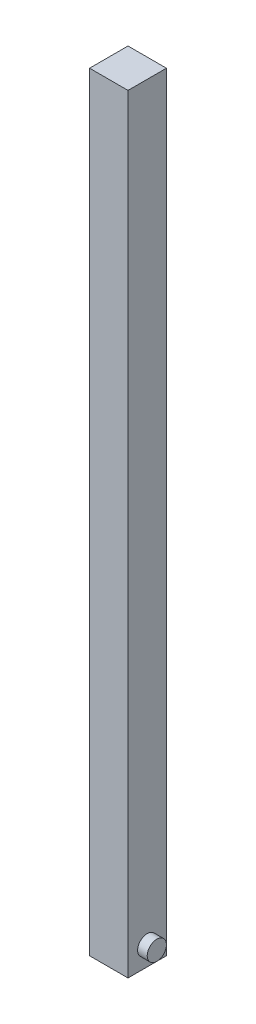
ISO-10303-21;
HEADER;
FILE_DESCRIPTION(('STEP AP214'),'2;1');
FILE_NAME('part.step','',(''),(''),'','','');
FILE_SCHEMA(('AUTOMOTIVE_DESIGN { 1 0 10303 214 1 1 1 1 }'));
ENDSEC;
DATA;
#1=APPLICATION_CONTEXT('core data for automotive mechanical design processes');
#2=APPLICATION_PROTOCOL_DEFINITION('international standard','automotive_design',2000,#1);
#3=PRODUCT_CONTEXT('',#1,'mechanical');
#4=PRODUCT('Part','Part','',(#3));
#5=PRODUCT_RELATED_PRODUCT_CATEGORY('part','',(#4));
#6=PRODUCT_DEFINITION_FORMATION('','',#4);
#7=PRODUCT_DEFINITION_CONTEXT('part definition',#1,'design');
#8=PRODUCT_DEFINITION('design','',#6,#7);
#9=PRODUCT_DEFINITION_SHAPE('','',#8);
#10=(LENGTH_UNIT() NAMED_UNIT(*) SI_UNIT(.MILLI.,.METRE.));
#11=(NAMED_UNIT(*) PLANE_ANGLE_UNIT() SI_UNIT($,.RADIAN.));
#12=(NAMED_UNIT(*) SI_UNIT($,.STERADIAN.) SOLID_ANGLE_UNIT());
#13=UNCERTAINTY_MEASURE_WITH_UNIT(LENGTH_MEASURE(1.E-05),#10,'distance_accuracy_value','');
#14=(GEOMETRIC_REPRESENTATION_CONTEXT(3) GLOBAL_UNCERTAINTY_ASSIGNED_CONTEXT((#13)) GLOBAL_UNIT_ASSIGNED_CONTEXT((#10,
#11,#12)) REPRESENTATION_CONTEXT('',''));
#15=CARTESIAN_POINT('',(0.,0.,0.));
#16=DIRECTION('',(0.,0.,1.));
#17=DIRECTION('',(1.,0.,0.));
#18=AXIS2_PLACEMENT_3D('',#15,#16,#17);
#19=CARTESIAN_POINT('',(0.,508.,0.));
#20=DIRECTION('',(1.,0.,0.));
#21=DIRECTION('',(0.,0.,-1.));
#22=AXIS2_PLACEMENT_3D('',#19,#20,#21);
#23=PLANE('',#22);
#24=DIRECTION('',(0.,0.,1.));
#25=VECTOR('',#24,1.);
#26=CARTESIAN_POINT('',(0.,0.,0.));
#27=LINE('',#26,#25);
#28=CARTESIAN_POINT('',(0.,0.,-25.4));
#29=VERTEX_POINT('',#28);
#30=CARTESIAN_POINT('',(0.,0.,0.));
#31=VERTEX_POINT('',#30);
#32=EDGE_CURVE('E110',#29,#31,#27,.T.);
#33=ORIENTED_EDGE('',*,*,#32,.T.);
#34=DIRECTION('',(0.,-1.,0.));
#35=VECTOR('',#34,1.);
#36=CARTESIAN_POINT('',(0.,508.,0.));
#37=LINE('',#36,#35);
#38=CARTESIAN_POINT('',(0.,508.,0.));
#39=VERTEX_POINT('',#38);
#40=EDGE_CURVE('E48',#39,#31,#37,.T.);
#41=ORIENTED_EDGE('',*,*,#40,.F.);
#42=DIRECTION('',(0.,0.,1.));
#43=VECTOR('',#42,1.);
#44=CARTESIAN_POINT('',(0.,508.,0.));
#45=LINE('',#44,#43);
#46=CARTESIAN_POINT('',(0.,508.,-25.4));
#47=VERTEX_POINT('',#46);
#48=EDGE_CURVE('E92',#47,#39,#45,.T.);
#49=ORIENTED_EDGE('',*,*,#48,.F.);
#50=DIRECTION('',(0.,-1.,0.));
#51=VECTOR('',#50,1.);
#52=CARTESIAN_POINT('',(0.,508.,-25.4));
#53=LINE('',#52,#51);
#54=EDGE_CURVE('E106',#47,#29,#53,.T.);
#55=ORIENTED_EDGE('',*,*,#54,.T.);
#56=EDGE_LOOP('',(#33,#41,#49,#55));
#57=FACE_BOUND('',#56,.T.);
#58=ADVANCED_FACE('F39',(#57),#23,.F.);
#59=CARTESIAN_POINT('',(0.,508.,0.));
#60=DIRECTION('',(0.,0.,-1.));
#61=DIRECTION('',(-1.,0.,0.));
#62=AXIS2_PLACEMENT_3D('',#59,#60,#61);
#63=PLANE('',#62);
#64=DIRECTION('',(1.,0.,0.));
#65=VECTOR('',#64,1.);
#66=CARTESIAN_POINT('',(0.,0.,0.));
#67=LINE('',#66,#65);
#68=CARTESIAN_POINT('',(25.4,0.,0.));
#69=VERTEX_POINT('',#68);
#70=EDGE_CURVE('E98',#31,#69,#67,.T.);
#71=ORIENTED_EDGE('',*,*,#70,.T.);
#72=DIRECTION('',(0.,-1.,0.));
#73=VECTOR('',#72,1.);
#74=CARTESIAN_POINT('',(25.4,508.,0.));
#75=LINE('',#74,#73);
#76=CARTESIAN_POINT('',(25.4,508.,0.));
#77=VERTEX_POINT('',#76);
#78=EDGE_CURVE('E96',#77,#69,#75,.T.);
#79=ORIENTED_EDGE('',*,*,#78,.F.);
#80=DIRECTION('',(1.,0.,0.));
#81=VECTOR('',#80,1.);
#82=CARTESIAN_POINT('',(0.,508.,0.));
#83=LINE('',#82,#81);
#84=EDGE_CURVE('E87',#39,#77,#83,.T.);
#85=ORIENTED_EDGE('',*,*,#84,.F.);
#86=ORIENTED_EDGE('',*,*,#40,.T.);
#87=EDGE_LOOP('',(#71,#79,#85,#86));
#88=FACE_BOUND('',#87,.T.);
#89=ADVANCED_FACE('F97',(#88),#63,.F.);
#90=CARTESIAN_POINT('',(25.4,508.,0.));
#91=DIRECTION('',(-1.,0.,0.));
#92=DIRECTION('',(0.,0.,1.));
#93=AXIS2_PLACEMENT_3D('',#90,#91,#92);
#94=PLANE('',#93);
#95=CARTESIAN_POINT('',(25.4,12.7,-12.7));
#96=DIRECTION('',(-1.,0.,0.));
#97=DIRECTION('',(0.,0.,1.));
#98=AXIS2_PLACEMENT_3D('',#95,#96,#97);
#99=CIRCLE('',#98,6.35);
#100=CARTESIAN_POINT('',(25.4,12.7,-6.35));
#101=VERTEX_POINT('',#100);
#102=EDGE_CURVE('E11',#101,#101,#99,.F.);
#103=ORIENTED_EDGE('',*,*,#102,.F.);
#104=EDGE_LOOP('',(#103));
#105=FACE_BOUND('',#104,.T.);
#106=DIRECTION('',(0.,0.,-1.));
#107=VECTOR('',#106,1.);
#108=CARTESIAN_POINT('',(25.4,0.,0.));
#109=LINE('',#108,#107);
#110=CARTESIAN_POINT('',(25.4,0.,-25.4));
#111=VERTEX_POINT('',#110);
#112=EDGE_CURVE('E73',#69,#111,#109,.T.);
#113=ORIENTED_EDGE('',*,*,#112,.T.);
#114=DIRECTION('',(0.,-1.,0.));
#115=VECTOR('',#114,1.);
#116=CARTESIAN_POINT('',(25.4,508.,-25.4));
#117=LINE('',#116,#115);
#118=CARTESIAN_POINT('',(25.4,508.,-25.4));
#119=VERTEX_POINT('',#118);
#120=EDGE_CURVE('E100',#119,#111,#117,.T.);
#121=ORIENTED_EDGE('',*,*,#120,.F.);
#122=DIRECTION('',(0.,0.,-1.));
#123=VECTOR('',#122,1.);
#124=CARTESIAN_POINT('',(25.4,508.,0.));
#125=LINE('',#124,#123);
#126=EDGE_CURVE('E90',#77,#119,#125,.T.);
#127=ORIENTED_EDGE('',*,*,#126,.F.);
#128=ORIENTED_EDGE('',*,*,#78,.T.);
#129=EDGE_LOOP('',(#113,#121,#127,#128));
#130=FACE_BOUND('',#129,.T.);
#131=ADVANCED_FACE('F102',(#105,#130),#94,.F.);
#132=CARTESIAN_POINT('',(0.,508.,-25.4));
#133=DIRECTION('',(0.,0.,1.));
#134=DIRECTION('',(1.,0.,0.));
#135=AXIS2_PLACEMENT_3D('',#132,#133,#134);
#136=PLANE('',#135);
#137=DIRECTION('',(-1.,0.,0.));
#138=VECTOR('',#137,1.);
#139=CARTESIAN_POINT('',(0.,0.,-25.4));
#140=LINE('',#139,#138);
#141=EDGE_CURVE('E79',#111,#29,#140,.T.);
#142=ORIENTED_EDGE('',*,*,#141,.T.);
#143=ORIENTED_EDGE('',*,*,#54,.F.);
#144=DIRECTION('',(-1.,0.,0.));
#145=VECTOR('',#144,1.);
#146=CARTESIAN_POINT('',(0.,508.,-25.4));
#147=LINE('',#146,#145);
#148=EDGE_CURVE('E56',#119,#47,#147,.T.);
#149=ORIENTED_EDGE('',*,*,#148,.F.);
#150=ORIENTED_EDGE('',*,*,#120,.T.);
#151=EDGE_LOOP('',(#142,#143,#149,#150));
#152=FACE_BOUND('',#151,.T.);
#153=ADVANCED_FACE('F139',(#152),#136,.F.);
#154=CARTESIAN_POINT('',(0.,508.,0.));
#155=DIRECTION('',(0.,-1.,0.));
#156=DIRECTION('',(0.,0.,-1.));
#157=AXIS2_PLACEMENT_3D('',#154,#155,#156);
#158=PLANE('',#157);
#159=ORIENTED_EDGE('',*,*,#48,.T.);
#160=ORIENTED_EDGE('',*,*,#84,.T.);
#161=ORIENTED_EDGE('',*,*,#126,.T.);
#162=ORIENTED_EDGE('',*,*,#148,.T.);
#163=EDGE_LOOP('',(#159,#160,#161,#162));
#164=FACE_BOUND('',#163,.T.);
#165=ADVANCED_FACE('F88',(#164),#158,.F.);
#166=CARTESIAN_POINT('',(0.,0.,0.));
#167=DIRECTION('',(0.,-1.,0.));
#168=DIRECTION('',(0.,0.,-1.));
#169=AXIS2_PLACEMENT_3D('',#166,#167,#168);
#170=PLANE('',#169);
#171=ORIENTED_EDGE('',*,*,#32,.F.);
#172=ORIENTED_EDGE('',*,*,#141,.F.);
#173=ORIENTED_EDGE('',*,*,#112,.F.);
#174=ORIENTED_EDGE('',*,*,#70,.F.);
#175=EDGE_LOOP('',(#171,#172,#173,#174));
#176=FACE_BOUND('',#175,.T.);
#177=ADVANCED_FACE('F128',(#176),#170,.T.);
#178=CARTESIAN_POINT('',(31.75,12.7,-12.7));
#179=DIRECTION('',(-1.,0.,0.));
#180=DIRECTION('',(0.,0.,1.));
#181=AXIS2_PLACEMENT_3D('',#178,#179,#180);
#182=CYLINDRICAL_SURFACE('',#181,6.35);
#183=CARTESIAN_POINT('',(31.75,12.7,-12.7));
#184=DIRECTION('',(1.,0.,0.));
#185=DIRECTION('',(0.,0.,-1.));
#186=AXIS2_PLACEMENT_3D('',#183,#184,#185);
#187=CIRCLE('',#186,6.35);
#188=CARTESIAN_POINT('',(31.75,12.7,-19.05));
#189=VERTEX_POINT('',#188);
#190=EDGE_CURVE('E114',#189,#189,#187,.T.);
#191=ORIENTED_EDGE('',*,*,#190,.F.);
#192=EDGE_LOOP('',(#191));
#193=FACE_BOUND('',#192,.T.);
#194=ORIENTED_EDGE('',*,*,#102,.T.);
#195=EDGE_LOOP('',(#194));
#196=FACE_BOUND('',#195,.T.);
#197=ADVANCED_FACE('F130',(#193,#196),#182,.T.);
#198=CARTESIAN_POINT('',(31.75,12.7,-12.7));
#199=DIRECTION('',(1.,0.,0.));
#200=DIRECTION('',(0.,0.,-1.));
#201=AXIS2_PLACEMENT_3D('',#198,#199,#200);
#202=PLANE('',#201);
#203=ORIENTED_EDGE('',*,*,#190,.T.);
#204=EDGE_LOOP('',(#203));
#205=FACE_BOUND('',#204,.T.);
#206=ADVANCED_FACE('F136',(#205),#202,.T.);
#207=CLOSED_SHELL('',(#58,#89,#131,#153,#165,#177,#197,#206));
#208=MANIFOLD_SOLID_BREP('B2',#207);
#209=ADVANCED_BREP_SHAPE_REPRESENTATION('',(#18,#208),#14);
#210=SHAPE_DEFINITION_REPRESENTATION(#9,#209);
ENDSEC;
END-ISO-10303-21;
